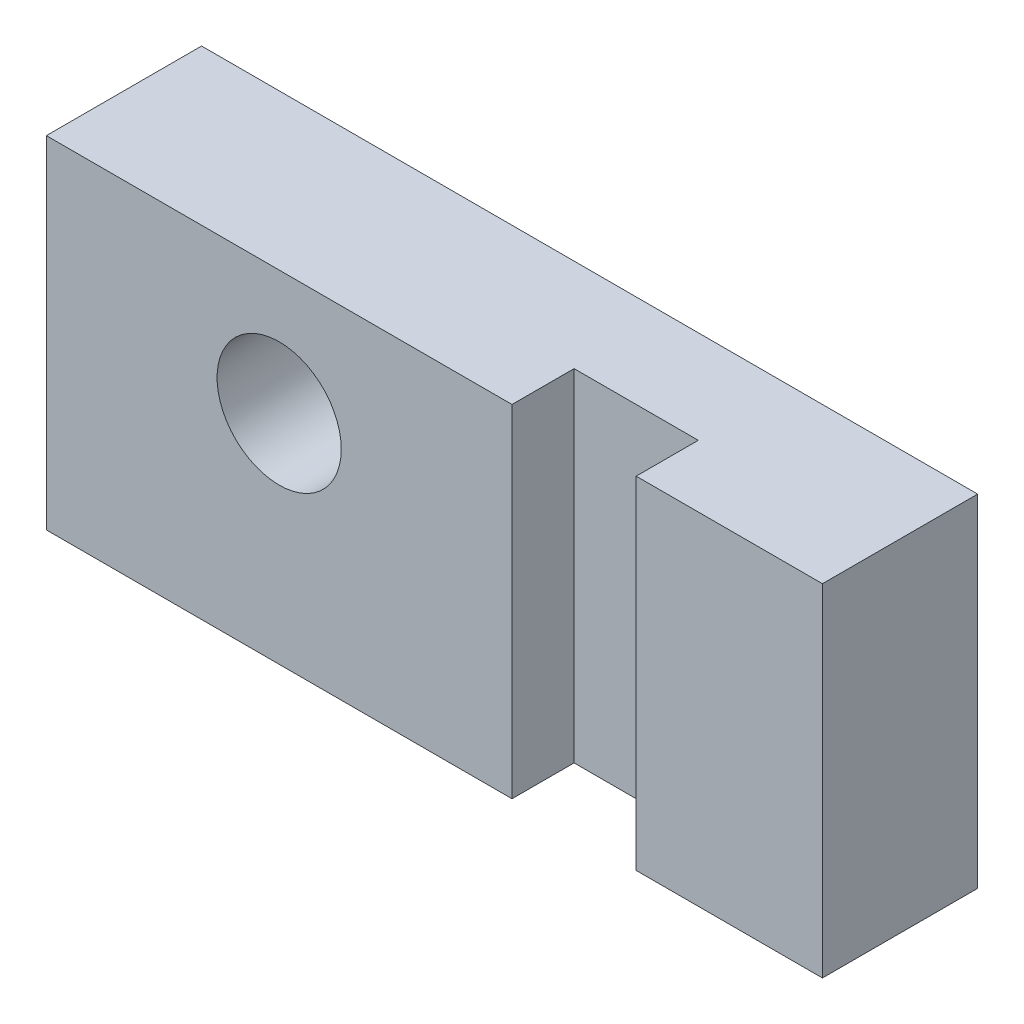
ISO-10303-21;
HEADER;
FILE_DESCRIPTION(('STEP AP214'),'2;1');
FILE_NAME('part.step','',(''),(''),'','','');
FILE_SCHEMA(('AUTOMOTIVE_DESIGN { 1 0 10303 214 1 1 1 1 }'));
ENDSEC;
DATA;
#1=APPLICATION_CONTEXT('core data for automotive mechanical design processes');
#2=APPLICATION_PROTOCOL_DEFINITION('international standard','automotive_design',2000,#1);
#3=PRODUCT_CONTEXT('',#1,'mechanical');
#4=PRODUCT('Part','Part','',(#3));
#5=PRODUCT_RELATED_PRODUCT_CATEGORY('part','',(#4));
#6=PRODUCT_DEFINITION_FORMATION('','',#4);
#7=PRODUCT_DEFINITION_CONTEXT('part definition',#1,'design');
#8=PRODUCT_DEFINITION('design','',#6,#7);
#9=PRODUCT_DEFINITION_SHAPE('','',#8);
#10=(LENGTH_UNIT() NAMED_UNIT(*) SI_UNIT(.MILLI.,.METRE.));
#11=(NAMED_UNIT(*) PLANE_ANGLE_UNIT() SI_UNIT($,.RADIAN.));
#12=(NAMED_UNIT(*) SI_UNIT($,.STERADIAN.) SOLID_ANGLE_UNIT());
#13=UNCERTAINTY_MEASURE_WITH_UNIT(LENGTH_MEASURE(1.E-05),#10,'distance_accuracy_value','');
#14=(GEOMETRIC_REPRESENTATION_CONTEXT(3) GLOBAL_UNCERTAINTY_ASSIGNED_CONTEXT((#13)) GLOBAL_UNIT_ASSIGNED_CONTEXT((#10,
#11,#12)) REPRESENTATION_CONTEXT('',''));
#15=CARTESIAN_POINT('',(0.,0.,0.));
#16=DIRECTION('',(0.,0.,1.));
#17=DIRECTION('',(1.,0.,0.));
#18=AXIS2_PLACEMENT_3D('',#15,#16,#17);
#19=CARTESIAN_POINT('',(0.,0.,10.));
#20=DIRECTION('',(0.,0.,-1.));
#21=DIRECTION('',(-1.,0.,0.));
#22=AXIS2_PLACEMENT_3D('',#19,#20,#21);
#23=PLANE('',#22);
#24=CARTESIAN_POINT('',(-10.,3.,10.));
#25=DIRECTION('',(0.,0.,1.));
#26=DIRECTION('',(1.,0.,0.));
#27=AXIS2_PLACEMENT_3D('',#24,#25,#26);
#28=CIRCLE('',#27,4.);
#29=CARTESIAN_POINT('',(-6.,3.,10.));
#30=VERTEX_POINT('',#29);
#31=EDGE_CURVE('E139',#30,#30,#28,.T.);
#32=ORIENTED_EDGE('',*,*,#31,.F.);
#33=EDGE_LOOP('',(#32));
#34=FACE_BOUND('',#33,.T.);
#35=DIRECTION('',(1.,0.,0.));
#36=VECTOR('',#35,1.);
#37=CARTESIAN_POINT('',(-25.,-11.,10.));
#38=LINE('',#37,#36);
#39=CARTESIAN_POINT('',(-25.,-11.,10.));
#40=VERTEX_POINT('',#39);
#41=CARTESIAN_POINT('',(5.,-11.,10.));
#42=VERTEX_POINT('',#41);
#43=EDGE_CURVE('E155',#40,#42,#38,.T.);
#44=ORIENTED_EDGE('',*,*,#43,.T.);
#45=DIRECTION('',(0.,-1.,0.));
#46=VECTOR('',#45,1.);
#47=CARTESIAN_POINT('',(4.99999999999999,11.,10.));
#48=LINE('',#47,#46);
#49=CARTESIAN_POINT('',(4.99999999999999,11.,10.));
#50=VERTEX_POINT('',#49);
#51=EDGE_CURVE('E114',#50,#42,#48,.T.);
#52=ORIENTED_EDGE('',*,*,#51,.F.);
#53=DIRECTION('',(-1.,0.,0.));
#54=VECTOR('',#53,1.);
#55=CARTESIAN_POINT('',(-25.,11.,10.));
#56=LINE('',#55,#54);
#57=CARTESIAN_POINT('',(-25.,11.,10.));
#58=VERTEX_POINT('',#57);
#59=EDGE_CURVE('E151',#50,#58,#56,.T.);
#60=ORIENTED_EDGE('',*,*,#59,.T.);
#61=DIRECTION('',(0.,-1.,0.));
#62=VECTOR('',#61,1.);
#63=CARTESIAN_POINT('',(-25.,-11.,10.));
#64=LINE('',#63,#62);
#65=EDGE_CURVE('E153',#58,#40,#64,.T.);
#66=ORIENTED_EDGE('',*,*,#65,.T.);
#67=EDGE_LOOP('',(#44,#52,#60,#66));
#68=FACE_BOUND('',#67,.T.);
#69=ADVANCED_FACE('F34',(#34,#68),#23,.F.);
#70=CARTESIAN_POINT('',(25.,-11.,10.));
#71=DIRECTION('',(-1.,0.,0.));
#72=DIRECTION('',(0.,0.,1.));
#73=AXIS2_PLACEMENT_3D('',#70,#71,#72);
#74=PLANE('',#73);
#75=DIRECTION('',(0.,1.,0.));
#76=VECTOR('',#75,1.);
#77=CARTESIAN_POINT('',(25.,-11.,0.));
#78=LINE('',#77,#76);
#79=CARTESIAN_POINT('',(25.,-11.,0.));
#80=VERTEX_POINT('',#79);
#81=CARTESIAN_POINT('',(25.,11.,0.));
#82=VERTEX_POINT('',#81);
#83=EDGE_CURVE('E146',#80,#82,#78,.T.);
#84=ORIENTED_EDGE('',*,*,#83,.T.);
#85=DIRECTION('',(0.,0.,-1.));
#86=VECTOR('',#85,1.);
#87=CARTESIAN_POINT('',(25.,11.,10.));
#88=LINE('',#87,#86);
#89=CARTESIAN_POINT('',(25.,11.,10.));
#90=VERTEX_POINT('',#89);
#91=EDGE_CURVE('E11',#90,#82,#88,.T.);
#92=ORIENTED_EDGE('',*,*,#91,.F.);
#93=DIRECTION('',(0.,1.,0.));
#94=VECTOR('',#93,1.);
#95=CARTESIAN_POINT('',(25.,-11.,10.));
#96=LINE('',#95,#94);
#97=CARTESIAN_POINT('',(25.,-11.,10.));
#98=VERTEX_POINT('',#97);
#99=EDGE_CURVE('E149',#98,#90,#96,.T.);
#100=ORIENTED_EDGE('',*,*,#99,.F.);
#101=DIRECTION('',(0.,0.,-1.));
#102=VECTOR('',#101,1.);
#103=CARTESIAN_POINT('',(25.,-11.,10.));
#104=LINE('',#103,#102);
#105=EDGE_CURVE('E157',#98,#80,#104,.T.);
#106=ORIENTED_EDGE('',*,*,#105,.T.);
#107=EDGE_LOOP('',(#84,#92,#100,#106));
#108=FACE_BOUND('',#107,.T.);
#109=ADVANCED_FACE('F36',(#108),#74,.F.);
#110=CARTESIAN_POINT('',(-25.,11.,10.));
#111=DIRECTION('',(0.,-1.,0.));
#112=DIRECTION('',(0.,0.,-1.));
#113=AXIS2_PLACEMENT_3D('',#110,#111,#112);
#114=PLANE('',#113);
#115=ORIENTED_EDGE('',*,*,#59,.F.);
#116=DIRECTION('',(0.,0.,1.));
#117=VECTOR('',#116,1.);
#118=CARTESIAN_POINT('',(4.99999999999999,11.,6.));
#119=LINE('',#118,#117);
#120=CARTESIAN_POINT('',(4.99999999999999,11.,6.));
#121=VERTEX_POINT('',#120);
#122=EDGE_CURVE('E137',#121,#50,#119,.T.);
#123=ORIENTED_EDGE('',*,*,#122,.F.);
#124=DIRECTION('',(-1.,0.,0.));
#125=VECTOR('',#124,1.);
#126=CARTESIAN_POINT('',(4.99999999999999,11.,6.));
#127=LINE('',#126,#125);
#128=CARTESIAN_POINT('',(13.,11.,6.));
#129=VERTEX_POINT('',#128);
#130=EDGE_CURVE('E118',#129,#121,#127,.T.);
#131=ORIENTED_EDGE('',*,*,#130,.F.);
#132=DIRECTION('',(0.,0.,1.));
#133=VECTOR('',#132,1.);
#134=CARTESIAN_POINT('',(13.,11.,6.));
#135=LINE('',#134,#133);
#136=CARTESIAN_POINT('',(13.,11.,10.));
#137=VERTEX_POINT('',#136);
#138=EDGE_CURVE('E140',#129,#137,#135,.T.);
#139=ORIENTED_EDGE('',*,*,#138,.T.);
#140=EDGE_CURVE('E86',#90,#137,#56,.T.);
#141=ORIENTED_EDGE('',*,*,#140,.F.);
#142=ORIENTED_EDGE('',*,*,#91,.T.);
#143=DIRECTION('',(-1.,0.,0.));
#144=VECTOR('',#143,1.);
#145=CARTESIAN_POINT('',(-25.,11.,0.));
#146=LINE('',#145,#144);
#147=CARTESIAN_POINT('',(-25.,11.,0.));
#148=VERTEX_POINT('',#147);
#149=EDGE_CURVE('E160',#82,#148,#146,.T.);
#150=ORIENTED_EDGE('',*,*,#149,.T.);
#151=DIRECTION('',(0.,0.,-1.));
#152=VECTOR('',#151,1.);
#153=CARTESIAN_POINT('',(-25.,11.,10.));
#154=LINE('',#153,#152);
#155=EDGE_CURVE('E42',#58,#148,#154,.T.);
#156=ORIENTED_EDGE('',*,*,#155,.F.);
#157=EDGE_LOOP('',(#115,#123,#131,#139,#141,#142,#150,#156));
#158=FACE_BOUND('',#157,.T.);
#159=ADVANCED_FACE('F183',(#158),#114,.F.);
#160=CARTESIAN_POINT('',(-25.,-11.,10.));
#161=DIRECTION('',(1.,0.,0.));
#162=DIRECTION('',(0.,0.,-1.));
#163=AXIS2_PLACEMENT_3D('',#160,#161,#162);
#164=PLANE('',#163);
#165=DIRECTION('',(0.,-1.,0.));
#166=VECTOR('',#165,1.);
#167=CARTESIAN_POINT('',(-25.,-11.,0.));
#168=LINE('',#167,#166);
#169=CARTESIAN_POINT('',(-25.,-11.,0.));
#170=VERTEX_POINT('',#169);
#171=EDGE_CURVE('E162',#148,#170,#168,.T.);
#172=ORIENTED_EDGE('',*,*,#171,.T.);
#173=DIRECTION('',(0.,0.,-1.));
#174=VECTOR('',#173,1.);
#175=CARTESIAN_POINT('',(-25.,-11.,10.));
#176=LINE('',#175,#174);
#177=EDGE_CURVE('E166',#40,#170,#176,.T.);
#178=ORIENTED_EDGE('',*,*,#177,.F.);
#179=ORIENTED_EDGE('',*,*,#65,.F.);
#180=ORIENTED_EDGE('',*,*,#155,.T.);
#181=EDGE_LOOP('',(#172,#178,#179,#180));
#182=FACE_BOUND('',#181,.T.);
#183=ADVANCED_FACE('F172',(#182),#164,.F.);
#184=CARTESIAN_POINT('',(-25.,-11.,10.));
#185=DIRECTION('',(0.,1.,0.));
#186=DIRECTION('',(0.,0.,1.));
#187=AXIS2_PLACEMENT_3D('',#184,#185,#186);
#188=PLANE('',#187);
#189=DIRECTION('',(1.,0.,0.));
#190=VECTOR('',#189,1.);
#191=CARTESIAN_POINT('',(5.,-11.,6.));
#192=LINE('',#191,#190);
#193=CARTESIAN_POINT('',(5.,-11.,6.));
#194=VERTEX_POINT('',#193);
#195=CARTESIAN_POINT('',(13.,-11.,6.));
#196=VERTEX_POINT('',#195);
#197=EDGE_CURVE('E124',#194,#196,#192,.T.);
#198=ORIENTED_EDGE('',*,*,#197,.F.);
#199=DIRECTION('',(0.,0.,1.));
#200=VECTOR('',#199,1.);
#201=CARTESIAN_POINT('',(5.,-11.,6.));
#202=LINE('',#201,#200);
#203=EDGE_CURVE('E108',#194,#42,#202,.T.);
#204=ORIENTED_EDGE('',*,*,#203,.T.);
#205=ORIENTED_EDGE('',*,*,#43,.F.);
#206=ORIENTED_EDGE('',*,*,#177,.T.);
#207=DIRECTION('',(1.,0.,0.));
#208=VECTOR('',#207,1.);
#209=CARTESIAN_POINT('',(-25.,-11.,0.));
#210=LINE('',#209,#208);
#211=EDGE_CURVE('E79',#170,#80,#210,.T.);
#212=ORIENTED_EDGE('',*,*,#211,.T.);
#213=ORIENTED_EDGE('',*,*,#105,.F.);
#214=CARTESIAN_POINT('',(13.,-11.,10.));
#215=VERTEX_POINT('',#214);
#216=EDGE_CURVE('E57',#215,#98,#38,.T.);
#217=ORIENTED_EDGE('',*,*,#216,.F.);
#218=DIRECTION('',(0.,0.,1.));
#219=VECTOR('',#218,1.);
#220=CARTESIAN_POINT('',(13.,-11.,6.));
#221=LINE('',#220,#219);
#222=EDGE_CURVE('E49',#196,#215,#221,.T.);
#223=ORIENTED_EDGE('',*,*,#222,.F.);
#224=EDGE_LOOP('',(#198,#204,#205,#206,#212,#213,#217,#223));
#225=FACE_BOUND('',#224,.T.);
#226=ADVANCED_FACE('F129',(#225),#188,.F.);
#227=ORIENTED_EDGE('',*,*,#140,.T.);
#228=DIRECTION('',(0.,1.,0.));
#229=VECTOR('',#228,1.);
#230=CARTESIAN_POINT('',(13.,11.,10.));
#231=LINE('',#230,#229);
#232=EDGE_CURVE('E127',#215,#137,#231,.T.);
#233=ORIENTED_EDGE('',*,*,#232,.F.);
#234=ORIENTED_EDGE('',*,*,#216,.T.);
#235=ORIENTED_EDGE('',*,*,#99,.T.);
#236=EDGE_LOOP('',(#227,#233,#234,#235));
#237=FACE_BOUND('',#236,.T.);
#238=ADVANCED_FACE('F181',(#237),#23,.F.);
#239=CARTESIAN_POINT('',(0.,0.,0.));
#240=DIRECTION('',(0.,0.,-1.));
#241=DIRECTION('',(-1.,0.,0.));
#242=AXIS2_PLACEMENT_3D('',#239,#240,#241);
#243=PLANE('',#242);
#244=CARTESIAN_POINT('',(-10.,3.,0.));
#245=DIRECTION('',(0.,0.,1.));
#246=DIRECTION('',(1.,0.,0.));
#247=AXIS2_PLACEMENT_3D('',#244,#245,#246);
#248=CIRCLE('',#247,4.);
#249=CARTESIAN_POINT('',(-6.,3.,0.));
#250=VERTEX_POINT('',#249);
#251=EDGE_CURVE('E143',#250,#250,#248,.T.);
#252=ORIENTED_EDGE('',*,*,#251,.T.);
#253=EDGE_LOOP('',(#252));
#254=FACE_BOUND('',#253,.T.);
#255=ORIENTED_EDGE('',*,*,#83,.F.);
#256=ORIENTED_EDGE('',*,*,#211,.F.);
#257=ORIENTED_EDGE('',*,*,#171,.F.);
#258=ORIENTED_EDGE('',*,*,#149,.F.);
#259=EDGE_LOOP('',(#255,#256,#257,#258));
#260=FACE_BOUND('',#259,.T.);
#261=ADVANCED_FACE('F177',(#254,#260),#243,.T.);
#262=CARTESIAN_POINT('',(-10.,3.,0.));
#263=DIRECTION('',(0.,0.,1.));
#264=DIRECTION('',(1.,0.,0.));
#265=AXIS2_PLACEMENT_3D('',#262,#263,#264);
#266=CYLINDRICAL_SURFACE('',#265,4.);
#267=ORIENTED_EDGE('',*,*,#251,.F.);
#268=EDGE_LOOP('',(#267));
#269=FACE_BOUND('',#268,.T.);
#270=ORIENTED_EDGE('',*,*,#31,.T.);
#271=EDGE_LOOP('',(#270));
#272=FACE_BOUND('',#271,.T.);
#273=ADVANCED_FACE('F199',(#269,#272),#266,.F.);
#274=CARTESIAN_POINT('',(4.99999999999999,11.,6.));
#275=DIRECTION('',(-1.,0.,0.));
#276=DIRECTION('',(0.,-1.,0.));
#277=AXIS2_PLACEMENT_3D('',#274,#275,#276);
#278=PLANE('',#277);
#279=ORIENTED_EDGE('',*,*,#51,.T.);
#280=ORIENTED_EDGE('',*,*,#203,.F.);
#281=DIRECTION('',(0.,-1.,0.));
#282=VECTOR('',#281,1.);
#283=CARTESIAN_POINT('',(4.99999999999999,11.,6.));
#284=LINE('',#283,#282);
#285=EDGE_CURVE('E111',#121,#194,#284,.T.);
#286=ORIENTED_EDGE('',*,*,#285,.F.);
#287=ORIENTED_EDGE('',*,*,#122,.T.);
#288=EDGE_LOOP('',(#279,#280,#286,#287));
#289=FACE_BOUND('',#288,.T.);
#290=ADVANCED_FACE('F110',(#289),#278,.F.);
#291=CARTESIAN_POINT('',(13.,11.,6.));
#292=DIRECTION('',(1.,0.,0.));
#293=DIRECTION('',(0.,1.,0.));
#294=AXIS2_PLACEMENT_3D('',#291,#292,#293);
#295=PLANE('',#294);
#296=ORIENTED_EDGE('',*,*,#232,.T.);
#297=ORIENTED_EDGE('',*,*,#138,.F.);
#298=DIRECTION('',(0.,1.,0.));
#299=VECTOR('',#298,1.);
#300=CARTESIAN_POINT('',(13.,11.,6.));
#301=LINE('',#300,#299);
#302=EDGE_CURVE('E130',#196,#129,#301,.T.);
#303=ORIENTED_EDGE('',*,*,#302,.F.);
#304=ORIENTED_EDGE('',*,*,#222,.T.);
#305=EDGE_LOOP('',(#296,#297,#303,#304));
#306=FACE_BOUND('',#305,.T.);
#307=ADVANCED_FACE('F182',(#306),#295,.F.);
#308=CARTESIAN_POINT('',(0.,0.,6.));
#309=DIRECTION('',(0.,0.,1.));
#310=DIRECTION('',(1.,0.,0.));
#311=AXIS2_PLACEMENT_3D('',#308,#309,#310);
#312=PLANE('',#311);
#313=ORIENTED_EDGE('',*,*,#285,.T.);
#314=ORIENTED_EDGE('',*,*,#197,.T.);
#315=ORIENTED_EDGE('',*,*,#302,.T.);
#316=ORIENTED_EDGE('',*,*,#130,.T.);
#317=EDGE_LOOP('',(#313,#314,#315,#316));
#318=FACE_BOUND('',#317,.T.);
#319=ADVANCED_FACE('F122',(#318),#312,.T.);
#320=CLOSED_SHELL('',(#69,#109,#159,#183,#226,#238,#261,#273,#290,#307,#319));
#321=MANIFOLD_SOLID_BREP('B2',#320);
#322=ADVANCED_BREP_SHAPE_REPRESENTATION('',(#18,#321),#14);
#323=SHAPE_DEFINITION_REPRESENTATION(#9,#322);
ENDSEC;
END-ISO-10303-21;
